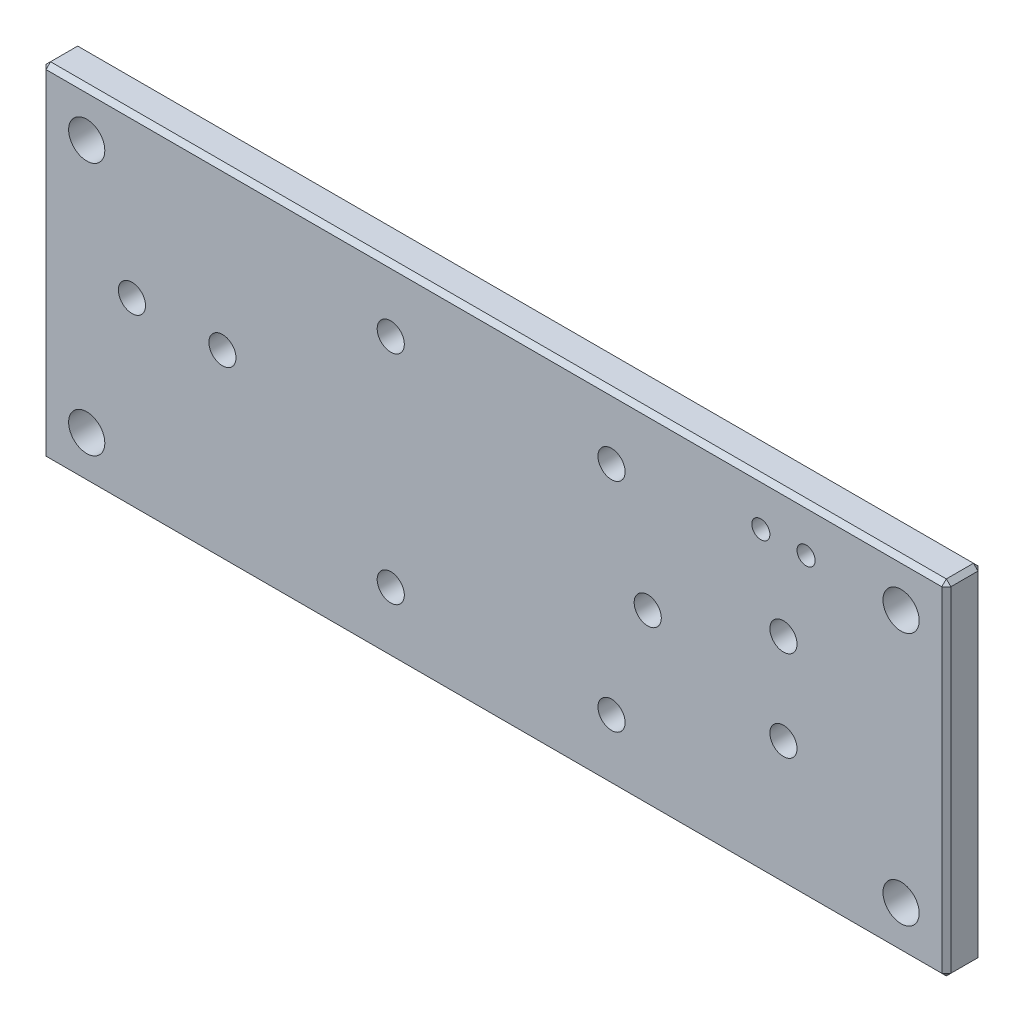
ISO-10303-21;
HEADER;
FILE_DESCRIPTION(('STEP AP214'),'2;1');
FILE_NAME('part.step','',(''),(''),'','','');
FILE_SCHEMA(('AUTOMOTIVE_DESIGN { 1 0 10303 214 1 1 1 1 }'));
ENDSEC;
DATA;
#1=APPLICATION_CONTEXT('core data for automotive mechanical design processes');
#2=APPLICATION_PROTOCOL_DEFINITION('international standard','automotive_design',2000,#1);
#3=PRODUCT_CONTEXT('',#1,'mechanical');
#4=PRODUCT('Part','Part','',(#3));
#5=PRODUCT_RELATED_PRODUCT_CATEGORY('part','',(#4));
#6=PRODUCT_DEFINITION_FORMATION('','',#4);
#7=PRODUCT_DEFINITION_CONTEXT('part definition',#1,'design');
#8=PRODUCT_DEFINITION('design','',#6,#7);
#9=PRODUCT_DEFINITION_SHAPE('','',#8);
#10=(LENGTH_UNIT() NAMED_UNIT(*) SI_UNIT(.MILLI.,.METRE.));
#11=(NAMED_UNIT(*) PLANE_ANGLE_UNIT() SI_UNIT($,.RADIAN.));
#12=(NAMED_UNIT(*) SI_UNIT($,.STERADIAN.) SOLID_ANGLE_UNIT());
#13=UNCERTAINTY_MEASURE_WITH_UNIT(LENGTH_MEASURE(1.E-05),#10,'distance_accuracy_value','');
#14=(GEOMETRIC_REPRESENTATION_CONTEXT(3) GLOBAL_UNCERTAINTY_ASSIGNED_CONTEXT((#13)) GLOBAL_UNIT_ASSIGNED_CONTEXT((#10,
#11,#12)) REPRESENTATION_CONTEXT('',''));
#15=CARTESIAN_POINT('',(0.,0.,0.));
#16=DIRECTION('',(0.,0.,1.));
#17=DIRECTION('',(1.,0.,0.));
#18=AXIS2_PLACEMENT_3D('',#15,#16,#17);
#19=CARTESIAN_POINT('',(0.,0.,2.));
#20=DIRECTION('',(0.,0.,-1.));
#21=DIRECTION('',(-1.,0.,0.));
#22=AXIS2_PLACEMENT_3D('',#19,#20,#21);
#23=PLANE('',#22);
#24=DIRECTION('',(-1.,0.,0.));
#25=VECTOR('',#24,1.);
#26=CARTESIAN_POINT('',(0.,9.25,2.));
#27=LINE('',#26,#25);
#28=CARTESIAN_POINT('',(24.75,9.25,2.));
#29=VERTEX_POINT('',#28);
#30=CARTESIAN_POINT('',(-24.75,9.25,2.));
#31=VERTEX_POINT('',#30);
#32=EDGE_CURVE('E188',#29,#31,#27,.T.);
#33=ORIENTED_EDGE('',*,*,#32,.T.);
#34=DIRECTION('',(0.,-1.,0.));
#35=VECTOR('',#34,1.);
#36=CARTESIAN_POINT('',(-24.75,0.,2.));
#37=LINE('',#36,#35);
#38=CARTESIAN_POINT('',(-24.75,-9.25,2.));
#39=VERTEX_POINT('',#38);
#40=EDGE_CURVE('E190',#31,#39,#37,.T.);
#41=ORIENTED_EDGE('',*,*,#40,.T.);
#42=DIRECTION('',(1.,0.,0.));
#43=VECTOR('',#42,1.);
#44=CARTESIAN_POINT('',(0.,-9.25,2.));
#45=LINE('',#44,#43);
#46=CARTESIAN_POINT('',(24.75,-9.25,2.));
#47=VERTEX_POINT('',#46);
#48=EDGE_CURVE('E184',#39,#47,#45,.T.);
#49=ORIENTED_EDGE('',*,*,#48,.T.);
#50=DIRECTION('',(0.,1.,0.));
#51=VECTOR('',#50,1.);
#52=CARTESIAN_POINT('',(24.75,0.,2.));
#53=LINE('',#52,#51);
#54=EDGE_CURVE('E186',#47,#29,#53,.T.);
#55=ORIENTED_EDGE('',*,*,#54,.T.);
#56=EDGE_LOOP('',(#33,#41,#49,#55));
#57=FACE_BOUND('',#56,.T.);
#58=CARTESIAN_POINT('',(17.25,7.,2.));
#59=DIRECTION('',(0.,0.,1.));
#60=DIRECTION('',(1.,0.,0.));
#61=AXIS2_PLACEMENT_3D('',#58,#59,#60);
#62=CIRCLE('',#61,0.499999999999999);
#63=CARTESIAN_POINT('',(17.75,7.,2.));
#64=VERTEX_POINT('',#63);
#65=EDGE_CURVE('E260',#64,#64,#62,.T.);
#66=ORIENTED_EDGE('',*,*,#65,.F.);
#67=EDGE_LOOP('',(#66));
#68=FACE_BOUND('',#67,.T.);
#69=CARTESIAN_POINT('',(14.75,7.,2.));
#70=DIRECTION('',(0.,0.,1.));
#71=DIRECTION('',(1.,0.,0.));
#72=AXIS2_PLACEMENT_3D('',#69,#70,#71);
#73=CIRCLE('',#72,0.500000000000001);
#74=CARTESIAN_POINT('',(15.25,7.,2.));
#75=VERTEX_POINT('',#74);
#76=EDGE_CURVE('E271',#75,#75,#73,.T.);
#77=ORIENTED_EDGE('',*,*,#76,.F.);
#78=EDGE_LOOP('',(#77));
#79=FACE_BOUND('',#78,.T.);
#80=CARTESIAN_POINT('',(-15.,0.699999999999999,2.));
#81=DIRECTION('',(0.,0.,1.));
#82=DIRECTION('',(1.,0.,0.));
#83=AXIS2_PLACEMENT_3D('',#80,#81,#82);
#84=CIRCLE('',#83,0.750000000000002);
#85=CARTESIAN_POINT('',(-14.25,0.699999999999999,2.));
#86=VERTEX_POINT('',#85);
#87=EDGE_CURVE('E277',#86,#86,#84,.T.);
#88=ORIENTED_EDGE('',*,*,#87,.F.);
#89=EDGE_LOOP('',(#88));
#90=FACE_BOUND('',#89,.T.);
#91=CARTESIAN_POINT('',(-20.,0.699999999999999,2.));
#92=DIRECTION('',(0.,0.,1.));
#93=DIRECTION('',(1.,0.,0.));
#94=AXIS2_PLACEMENT_3D('',#91,#92,#93);
#95=CIRCLE('',#94,0.750000000000002);
#96=CARTESIAN_POINT('',(-19.25,0.699999999999999,2.));
#97=VERTEX_POINT('',#96);
#98=EDGE_CURVE('E283',#97,#97,#95,.T.);
#99=ORIENTED_EDGE('',*,*,#98,.F.);
#100=EDGE_LOOP('',(#99));
#101=FACE_BOUND('',#100,.T.);
#102=CARTESIAN_POINT('',(16.,-2.5,2.));
#103=DIRECTION('',(0.,0.,1.));
#104=DIRECTION('',(1.,0.,0.));
#105=AXIS2_PLACEMENT_3D('',#102,#103,#104);
#106=CIRCLE('',#105,0.750000000000002);
#107=CARTESIAN_POINT('',(16.75,-2.5,2.));
#108=VERTEX_POINT('',#107);
#109=EDGE_CURVE('E289',#108,#108,#106,.T.);
#110=ORIENTED_EDGE('',*,*,#109,.F.);
#111=EDGE_LOOP('',(#110));
#112=FACE_BOUND('',#111,.T.);
#113=CARTESIAN_POINT('',(16.,2.5,2.));
#114=DIRECTION('',(0.,0.,1.));
#115=DIRECTION('',(1.,0.,0.));
#116=AXIS2_PLACEMENT_3D('',#113,#114,#115);
#117=CIRCLE('',#116,0.750000000000002);
#118=CARTESIAN_POINT('',(16.75,2.5,2.));
#119=VERTEX_POINT('',#118);
#120=EDGE_CURVE('E295',#119,#119,#117,.T.);
#121=ORIENTED_EDGE('',*,*,#120,.F.);
#122=EDGE_LOOP('',(#121));
#123=FACE_BOUND('',#122,.T.);
#124=CARTESIAN_POINT('',(8.49999999999999,0.,2.));
#125=DIRECTION('',(0.,0.,1.));
#126=DIRECTION('',(1.,0.,0.));
#127=AXIS2_PLACEMENT_3D('',#124,#125,#126);
#128=CIRCLE('',#127,0.750000000000002);
#129=CARTESIAN_POINT('',(9.25,0.,2.));
#130=VERTEX_POINT('',#129);
#131=EDGE_CURVE('E301',#130,#130,#128,.T.);
#132=ORIENTED_EDGE('',*,*,#131,.F.);
#133=EDGE_LOOP('',(#132));
#134=FACE_BOUND('',#133,.T.);
#135=CARTESIAN_POINT('',(6.5,-6.,2.));
#136=DIRECTION('',(0.,0.,1.));
#137=DIRECTION('',(1.,0.,0.));
#138=AXIS2_PLACEMENT_3D('',#135,#136,#137);
#139=CIRCLE('',#138,0.750000000000002);
#140=CARTESIAN_POINT('',(7.25,-6.,2.));
#141=VERTEX_POINT('',#140);
#142=EDGE_CURVE('E307',#141,#141,#139,.T.);
#143=ORIENTED_EDGE('',*,*,#142,.F.);
#144=EDGE_LOOP('',(#143));
#145=FACE_BOUND('',#144,.T.);
#146=CARTESIAN_POINT('',(6.5,6.,2.));
#147=DIRECTION('',(0.,0.,1.));
#148=DIRECTION('',(1.,0.,0.));
#149=AXIS2_PLACEMENT_3D('',#146,#147,#148);
#150=CIRCLE('',#149,0.750000000000002);
#151=CARTESIAN_POINT('',(7.25,6.,2.));
#152=VERTEX_POINT('',#151);
#153=EDGE_CURVE('E313',#152,#152,#150,.T.);
#154=ORIENTED_EDGE('',*,*,#153,.F.);
#155=EDGE_LOOP('',(#154));
#156=FACE_BOUND('',#155,.T.);
#157=CARTESIAN_POINT('',(-5.7,-6.,2.));
#158=DIRECTION('',(0.,0.,1.));
#159=DIRECTION('',(1.,0.,0.));
#160=AXIS2_PLACEMENT_3D('',#157,#158,#159);
#161=CIRCLE('',#160,0.75);
#162=CARTESIAN_POINT('',(-4.95,-6.,2.));
#163=VERTEX_POINT('',#162);
#164=EDGE_CURVE('E319',#163,#163,#161,.T.);
#165=ORIENTED_EDGE('',*,*,#164,.F.);
#166=EDGE_LOOP('',(#165));
#167=FACE_BOUND('',#166,.T.);
#168=CARTESIAN_POINT('',(-5.7,6.,2.));
#169=DIRECTION('',(0.,0.,1.));
#170=DIRECTION('',(1.,0.,0.));
#171=AXIS2_PLACEMENT_3D('',#168,#169,#170);
#172=CIRCLE('',#171,0.75);
#173=CARTESIAN_POINT('',(-4.95,6.,2.));
#174=VERTEX_POINT('',#173);
#175=EDGE_CURVE('E325',#174,#174,#172,.T.);
#176=ORIENTED_EDGE('',*,*,#175,.F.);
#177=EDGE_LOOP('',(#176));
#178=FACE_BOUND('',#177,.T.);
#179=CARTESIAN_POINT('',(-22.5,7.,2.));
#180=DIRECTION('',(0.,0.,1.));
#181=DIRECTION('',(1.,0.,0.));
#182=AXIS2_PLACEMENT_3D('',#179,#180,#181);
#183=CIRCLE('',#182,1.);
#184=CARTESIAN_POINT('',(-21.5,7.,2.));
#185=VERTEX_POINT('',#184);
#186=EDGE_CURVE('E156',#185,#185,#183,.T.);
#187=ORIENTED_EDGE('',*,*,#186,.F.);
#188=EDGE_LOOP('',(#187));
#189=FACE_BOUND('',#188,.T.);
#190=CARTESIAN_POINT('',(22.5,7.,2.));
#191=DIRECTION('',(0.,0.,1.));
#192=DIRECTION('',(1.,0.,0.));
#193=AXIS2_PLACEMENT_3D('',#190,#191,#192);
#194=CIRCLE('',#193,1.);
#195=CARTESIAN_POINT('',(23.5,7.,2.));
#196=VERTEX_POINT('',#195);
#197=EDGE_CURVE('E346',#196,#196,#194,.T.);
#198=ORIENTED_EDGE('',*,*,#197,.F.);
#199=EDGE_LOOP('',(#198));
#200=FACE_BOUND('',#199,.T.);
#201=CARTESIAN_POINT('',(22.5,-7.,2.));
#202=DIRECTION('',(0.,0.,1.));
#203=DIRECTION('',(1.,0.,0.));
#204=AXIS2_PLACEMENT_3D('',#201,#202,#203);
#205=CIRCLE('',#204,1.);
#206=CARTESIAN_POINT('',(23.5,-7.,2.));
#207=VERTEX_POINT('',#206);
#208=EDGE_CURVE('E340',#207,#207,#205,.T.);
#209=ORIENTED_EDGE('',*,*,#208,.F.);
#210=EDGE_LOOP('',(#209));
#211=FACE_BOUND('',#210,.T.);
#212=CARTESIAN_POINT('',(-22.5,-7.,2.));
#213=DIRECTION('',(0.,0.,1.));
#214=DIRECTION('',(1.,0.,0.));
#215=AXIS2_PLACEMENT_3D('',#212,#213,#214);
#216=CIRCLE('',#215,1.);
#217=CARTESIAN_POINT('',(-21.5,-7.,2.));
#218=VERTEX_POINT('',#217);
#219=EDGE_CURVE('E334',#218,#218,#216,.T.);
#220=ORIENTED_EDGE('',*,*,#219,.F.);
#221=EDGE_LOOP('',(#220));
#222=FACE_BOUND('',#221,.T.);
#223=ADVANCED_FACE('F35',(#57,#68,#79,#90,#101,#112,#123,#134,#145,#156,#167,#178,#189,#200,
#211,#222),#23,.F.);
#224=CARTESIAN_POINT('',(0.,0.,0.));
#225=DIRECTION('',(0.,0.,-1.));
#226=DIRECTION('',(-1.,0.,0.));
#227=AXIS2_PLACEMENT_3D('',#224,#225,#226);
#228=PLANE('',#227);
#229=DIRECTION('',(-1.,0.,0.));
#230=VECTOR('',#229,1.);
#231=CARTESIAN_POINT('',(-25.,-9.25,0.));
#232=LINE('',#231,#230);
#233=CARTESIAN_POINT('',(24.75,-9.25,0.));
#234=VERTEX_POINT('',#233);
#235=CARTESIAN_POINT('',(-24.75,-9.25,0.));
#236=VERTEX_POINT('',#235);
#237=EDGE_CURVE('E175',#234,#236,#232,.T.);
#238=ORIENTED_EDGE('',*,*,#237,.T.);
#239=DIRECTION('',(0.,1.,0.));
#240=VECTOR('',#239,1.);
#241=CARTESIAN_POINT('',(-24.75,9.5,0.));
#242=LINE('',#241,#240);
#243=CARTESIAN_POINT('',(-24.75,9.25,0.));
#244=VERTEX_POINT('',#243);
#245=EDGE_CURVE('E181',#236,#244,#242,.T.);
#246=ORIENTED_EDGE('',*,*,#245,.T.);
#247=DIRECTION('',(1.,0.,0.));
#248=VECTOR('',#247,1.);
#249=CARTESIAN_POINT('',(25.,9.25,0.));
#250=LINE('',#249,#248);
#251=CARTESIAN_POINT('',(24.75,9.25,0.));
#252=VERTEX_POINT('',#251);
#253=EDGE_CURVE('E179',#244,#252,#250,.T.);
#254=ORIENTED_EDGE('',*,*,#253,.T.);
#255=DIRECTION('',(0.,-1.,0.));
#256=VECTOR('',#255,1.);
#257=CARTESIAN_POINT('',(24.75,-9.5,0.));
#258=LINE('',#257,#256);
#259=EDGE_CURVE('E177',#252,#234,#258,.T.);
#260=ORIENTED_EDGE('',*,*,#259,.T.);
#261=EDGE_LOOP('',(#238,#246,#254,#260));
#262=FACE_BOUND('',#261,.T.);
#263=CARTESIAN_POINT('',(17.25,7.,0.));
#264=DIRECTION('',(0.,0.,1.));
#265=DIRECTION('',(1.,0.,0.));
#266=AXIS2_PLACEMENT_3D('',#263,#264,#265);
#267=CIRCLE('',#266,0.499999999999999);
#268=CARTESIAN_POINT('',(17.75,7.,0.));
#269=VERTEX_POINT('',#268);
#270=EDGE_CURVE('E266',#269,#269,#267,.T.);
#271=ORIENTED_EDGE('',*,*,#270,.T.);
#272=EDGE_LOOP('',(#271));
#273=FACE_BOUND('',#272,.T.);
#274=CARTESIAN_POINT('',(14.75,7.,0.));
#275=DIRECTION('',(0.,0.,1.));
#276=DIRECTION('',(1.,0.,0.));
#277=AXIS2_PLACEMENT_3D('',#274,#275,#276);
#278=CIRCLE('',#277,0.500000000000001);
#279=CARTESIAN_POINT('',(15.25,7.,0.));
#280=VERTEX_POINT('',#279);
#281=EDGE_CURVE('E274',#280,#280,#278,.T.);
#282=ORIENTED_EDGE('',*,*,#281,.T.);
#283=EDGE_LOOP('',(#282));
#284=FACE_BOUND('',#283,.T.);
#285=CARTESIAN_POINT('',(-15.,0.699999999999999,0.));
#286=DIRECTION('',(0.,0.,1.));
#287=DIRECTION('',(1.,0.,0.));
#288=AXIS2_PLACEMENT_3D('',#285,#286,#287);
#289=CIRCLE('',#288,0.750000000000002);
#290=CARTESIAN_POINT('',(-14.25,0.699999999999999,0.));
#291=VERTEX_POINT('',#290);
#292=EDGE_CURVE('E280',#291,#291,#289,.T.);
#293=ORIENTED_EDGE('',*,*,#292,.T.);
#294=EDGE_LOOP('',(#293));
#295=FACE_BOUND('',#294,.T.);
#296=CARTESIAN_POINT('',(-20.,0.699999999999999,0.));
#297=DIRECTION('',(0.,0.,1.));
#298=DIRECTION('',(1.,0.,0.));
#299=AXIS2_PLACEMENT_3D('',#296,#297,#298);
#300=CIRCLE('',#299,0.750000000000002);
#301=CARTESIAN_POINT('',(-19.25,0.699999999999999,0.));
#302=VERTEX_POINT('',#301);
#303=EDGE_CURVE('E286',#302,#302,#300,.T.);
#304=ORIENTED_EDGE('',*,*,#303,.T.);
#305=EDGE_LOOP('',(#304));
#306=FACE_BOUND('',#305,.T.);
#307=CARTESIAN_POINT('',(16.,-2.5,0.));
#308=DIRECTION('',(0.,0.,1.));
#309=DIRECTION('',(1.,0.,0.));
#310=AXIS2_PLACEMENT_3D('',#307,#308,#309);
#311=CIRCLE('',#310,0.750000000000002);
#312=CARTESIAN_POINT('',(16.75,-2.5,0.));
#313=VERTEX_POINT('',#312);
#314=EDGE_CURVE('E292',#313,#313,#311,.T.);
#315=ORIENTED_EDGE('',*,*,#314,.T.);
#316=EDGE_LOOP('',(#315));
#317=FACE_BOUND('',#316,.T.);
#318=CARTESIAN_POINT('',(16.,2.5,0.));
#319=DIRECTION('',(0.,0.,1.));
#320=DIRECTION('',(1.,0.,0.));
#321=AXIS2_PLACEMENT_3D('',#318,#319,#320);
#322=CIRCLE('',#321,0.750000000000002);
#323=CARTESIAN_POINT('',(16.75,2.5,0.));
#324=VERTEX_POINT('',#323);
#325=EDGE_CURVE('E298',#324,#324,#322,.T.);
#326=ORIENTED_EDGE('',*,*,#325,.T.);
#327=EDGE_LOOP('',(#326));
#328=FACE_BOUND('',#327,.T.);
#329=CARTESIAN_POINT('',(8.49999999999999,0.,0.));
#330=DIRECTION('',(0.,0.,1.));
#331=DIRECTION('',(1.,0.,0.));
#332=AXIS2_PLACEMENT_3D('',#329,#330,#331);
#333=CIRCLE('',#332,0.750000000000002);
#334=CARTESIAN_POINT('',(9.25,0.,0.));
#335=VERTEX_POINT('',#334);
#336=EDGE_CURVE('E304',#335,#335,#333,.T.);
#337=ORIENTED_EDGE('',*,*,#336,.T.);
#338=EDGE_LOOP('',(#337));
#339=FACE_BOUND('',#338,.T.);
#340=CARTESIAN_POINT('',(6.5,-6.,0.));
#341=DIRECTION('',(0.,0.,1.));
#342=DIRECTION('',(1.,0.,0.));
#343=AXIS2_PLACEMENT_3D('',#340,#341,#342);
#344=CIRCLE('',#343,0.750000000000002);
#345=CARTESIAN_POINT('',(7.25,-6.,0.));
#346=VERTEX_POINT('',#345);
#347=EDGE_CURVE('E310',#346,#346,#344,.T.);
#348=ORIENTED_EDGE('',*,*,#347,.T.);
#349=EDGE_LOOP('',(#348));
#350=FACE_BOUND('',#349,.T.);
#351=CARTESIAN_POINT('',(6.5,6.,0.));
#352=DIRECTION('',(0.,0.,1.));
#353=DIRECTION('',(1.,0.,0.));
#354=AXIS2_PLACEMENT_3D('',#351,#352,#353);
#355=CIRCLE('',#354,0.750000000000002);
#356=CARTESIAN_POINT('',(7.25,6.,0.));
#357=VERTEX_POINT('',#356);
#358=EDGE_CURVE('E316',#357,#357,#355,.T.);
#359=ORIENTED_EDGE('',*,*,#358,.T.);
#360=EDGE_LOOP('',(#359));
#361=FACE_BOUND('',#360,.T.);
#362=CARTESIAN_POINT('',(-5.7,-6.,0.));
#363=DIRECTION('',(0.,0.,1.));
#364=DIRECTION('',(1.,0.,0.));
#365=AXIS2_PLACEMENT_3D('',#362,#363,#364);
#366=CIRCLE('',#365,0.75);
#367=CARTESIAN_POINT('',(-4.95,-6.,0.));
#368=VERTEX_POINT('',#367);
#369=EDGE_CURVE('E322',#368,#368,#366,.T.);
#370=ORIENTED_EDGE('',*,*,#369,.T.);
#371=EDGE_LOOP('',(#370));
#372=FACE_BOUND('',#371,.T.);
#373=CARTESIAN_POINT('',(-5.7,6.,0.));
#374=DIRECTION('',(0.,0.,1.));
#375=DIRECTION('',(1.,0.,0.));
#376=AXIS2_PLACEMENT_3D('',#373,#374,#375);
#377=CIRCLE('',#376,0.75);
#378=CARTESIAN_POINT('',(-4.95,6.,0.));
#379=VERTEX_POINT('',#378);
#380=EDGE_CURVE('E328',#379,#379,#377,.T.);
#381=ORIENTED_EDGE('',*,*,#380,.T.);
#382=EDGE_LOOP('',(#381));
#383=FACE_BOUND('',#382,.T.);
#384=CARTESIAN_POINT('',(22.5,-7.,0.));
#385=DIRECTION('',(0.,0.,1.));
#386=DIRECTION('',(1.,0.,0.));
#387=AXIS2_PLACEMENT_3D('',#384,#385,#386);
#388=CIRCLE('',#387,1.);
#389=CARTESIAN_POINT('',(23.5,-7.,0.));
#390=VERTEX_POINT('',#389);
#391=EDGE_CURVE('E337',#390,#390,#388,.T.);
#392=ORIENTED_EDGE('',*,*,#391,.T.);
#393=EDGE_LOOP('',(#392));
#394=FACE_BOUND('',#393,.T.);
#395=CARTESIAN_POINT('',(-22.5,7.,0.));
#396=DIRECTION('',(0.,0.,1.));
#397=DIRECTION('',(1.,0.,0.));
#398=AXIS2_PLACEMENT_3D('',#395,#396,#397);
#399=CIRCLE('',#398,1.);
#400=CARTESIAN_POINT('',(-21.5,7.,0.));
#401=VERTEX_POINT('',#400);
#402=EDGE_CURVE('E159',#401,#401,#399,.T.);
#403=ORIENTED_EDGE('',*,*,#402,.T.);
#404=EDGE_LOOP('',(#403));
#405=FACE_BOUND('',#404,.T.);
#406=CARTESIAN_POINT('',(22.5,7.,0.));
#407=DIRECTION('',(0.,0.,1.));
#408=DIRECTION('',(1.,0.,0.));
#409=AXIS2_PLACEMENT_3D('',#406,#407,#408);
#410=CIRCLE('',#409,1.);
#411=CARTESIAN_POINT('',(23.5,7.,0.));
#412=VERTEX_POINT('',#411);
#413=EDGE_CURVE('E343',#412,#412,#410,.T.);
#414=ORIENTED_EDGE('',*,*,#413,.T.);
#415=EDGE_LOOP('',(#414));
#416=FACE_BOUND('',#415,.T.);
#417=CARTESIAN_POINT('',(-22.5,-7.,0.));
#418=DIRECTION('',(0.,0.,1.));
#419=DIRECTION('',(1.,0.,0.));
#420=AXIS2_PLACEMENT_3D('',#417,#418,#419);
#421=CIRCLE('',#420,1.);
#422=CARTESIAN_POINT('',(-21.5,-7.,0.));
#423=VERTEX_POINT('',#422);
#424=EDGE_CURVE('E331',#423,#423,#421,.T.);
#425=ORIENTED_EDGE('',*,*,#424,.T.);
#426=EDGE_LOOP('',(#425));
#427=FACE_BOUND('',#426,.T.);
#428=ADVANCED_FACE('F352',(#262,#273,#284,#295,#306,#317,#328,#339,#350,#361,#372,#383,#394,
#405,#416,#427),#228,.T.);
#429=CARTESIAN_POINT('',(25.,-9.5,2.));
#430=DIRECTION('',(-1.,0.,0.));
#431=DIRECTION('',(0.,0.,1.));
#432=AXIS2_PLACEMENT_3D('',#429,#430,#431);
#433=PLANE('',#432);
#434=DIRECTION('',(0.,1.,0.));
#435=VECTOR('',#434,1.);
#436=CARTESIAN_POINT('',(25.,9.5,0.25));
#437=LINE('',#436,#435);
#438=CARTESIAN_POINT('',(25.,-9.25,0.25));
#439=VERTEX_POINT('',#438);
#440=CARTESIAN_POINT('',(25.,9.25,0.25));
#441=VERTEX_POINT('',#440);
#442=EDGE_CURVE('E44',#439,#441,#437,.T.);
#443=ORIENTED_EDGE('',*,*,#442,.T.);
#444=DIRECTION('',(0.,0.,1.));
#445=VECTOR('',#444,1.);
#446=CARTESIAN_POINT('',(25.,9.25,2.));
#447=LINE('',#446,#445);
#448=CARTESIAN_POINT('',(25.,9.25,1.75));
#449=VERTEX_POINT('',#448);
#450=EDGE_CURVE('E11',#441,#449,#447,.T.);
#451=ORIENTED_EDGE('',*,*,#450,.T.);
#452=DIRECTION('',(0.,-1.,0.));
#453=VECTOR('',#452,1.);
#454=CARTESIAN_POINT('',(25.,-9.5,1.75));
#455=LINE('',#454,#453);
#456=CARTESIAN_POINT('',(25.,-9.25,1.75));
#457=VERTEX_POINT('',#456);
#458=EDGE_CURVE('E202',#449,#457,#455,.T.);
#459=ORIENTED_EDGE('',*,*,#458,.T.);
#460=DIRECTION('',(0.,0.,-1.));
#461=VECTOR('',#460,1.);
#462=CARTESIAN_POINT('',(25.,-9.25,2.));
#463=LINE('',#462,#461);
#464=EDGE_CURVE('E55',#457,#439,#463,.T.);
#465=ORIENTED_EDGE('',*,*,#464,.T.);
#466=EDGE_LOOP('',(#443,#451,#459,#465));
#467=FACE_BOUND('',#466,.T.);
#468=ADVANCED_FACE('F376',(#467),#433,.F.);
#469=CARTESIAN_POINT('',(-25.,9.5,2.));
#470=DIRECTION('',(0.,-1.,0.));
#471=DIRECTION('',(0.,0.,-1.));
#472=AXIS2_PLACEMENT_3D('',#469,#470,#471);
#473=PLANE('',#472);
#474=DIRECTION('',(-1.,0.,0.));
#475=VECTOR('',#474,1.);
#476=CARTESIAN_POINT('',(-25.,9.5,0.25));
#477=LINE('',#476,#475);
#478=CARTESIAN_POINT('',(24.75,9.5,0.25));
#479=VERTEX_POINT('',#478);
#480=CARTESIAN_POINT('',(-24.75,9.5,0.25));
#481=VERTEX_POINT('',#480);
#482=EDGE_CURVE('E197',#479,#481,#477,.T.);
#483=ORIENTED_EDGE('',*,*,#482,.T.);
#484=DIRECTION('',(0.,0.,1.));
#485=VECTOR('',#484,1.);
#486=CARTESIAN_POINT('',(-24.75,9.5,2.));
#487=LINE('',#486,#485);
#488=CARTESIAN_POINT('',(-24.75,9.5,1.75));
#489=VERTEX_POINT('',#488);
#490=EDGE_CURVE('E199',#481,#489,#487,.T.);
#491=ORIENTED_EDGE('',*,*,#490,.T.);
#492=DIRECTION('',(1.,0.,0.));
#493=VECTOR('',#492,1.);
#494=CARTESIAN_POINT('',(-25.,9.5,1.75));
#495=LINE('',#494,#493);
#496=CARTESIAN_POINT('',(24.75,9.5,1.75));
#497=VERTEX_POINT('',#496);
#498=EDGE_CURVE('E195',#489,#497,#495,.T.);
#499=ORIENTED_EDGE('',*,*,#498,.T.);
#500=DIRECTION('',(0.,0.,-1.));
#501=VECTOR('',#500,1.);
#502=CARTESIAN_POINT('',(24.75,9.5,2.));
#503=LINE('',#502,#501);
#504=EDGE_CURVE('E193',#497,#479,#503,.T.);
#505=ORIENTED_EDGE('',*,*,#504,.T.);
#506=EDGE_LOOP('',(#483,#491,#499,#505));
#507=FACE_BOUND('',#506,.T.);
#508=ADVANCED_FACE('F386',(#507),#473,.F.);
#509=CARTESIAN_POINT('',(-25.,-9.5,2.));
#510=DIRECTION('',(1.,0.,0.));
#511=DIRECTION('',(0.,0.,-1.));
#512=AXIS2_PLACEMENT_3D('',#509,#510,#511);
#513=PLANE('',#512);
#514=DIRECTION('',(0.,-1.,0.));
#515=VECTOR('',#514,1.);
#516=CARTESIAN_POINT('',(-25.,-9.5,0.25));
#517=LINE('',#516,#515);
#518=CARTESIAN_POINT('',(-25.,9.25,0.25));
#519=VERTEX_POINT('',#518);
#520=CARTESIAN_POINT('',(-25.,-9.25,0.25));
#521=VERTEX_POINT('',#520);
#522=EDGE_CURVE('E170',#519,#521,#517,.T.);
#523=ORIENTED_EDGE('',*,*,#522,.T.);
#524=DIRECTION('',(0.,0.,1.));
#525=VECTOR('',#524,1.);
#526=CARTESIAN_POINT('',(-25.,-9.25,2.));
#527=LINE('',#526,#525);
#528=CARTESIAN_POINT('',(-25.,-9.25,1.75));
#529=VERTEX_POINT('',#528);
#530=EDGE_CURVE('E172',#521,#529,#527,.T.);
#531=ORIENTED_EDGE('',*,*,#530,.T.);
#532=DIRECTION('',(0.,1.,0.));
#533=VECTOR('',#532,1.);
#534=CARTESIAN_POINT('',(-25.,-9.5,1.75));
#535=LINE('',#534,#533);
#536=CARTESIAN_POINT('',(-25.,9.25,1.75));
#537=VERTEX_POINT('',#536);
#538=EDGE_CURVE('E168',#529,#537,#535,.T.);
#539=ORIENTED_EDGE('',*,*,#538,.T.);
#540=DIRECTION('',(0.,0.,-1.));
#541=VECTOR('',#540,1.);
#542=CARTESIAN_POINT('',(-25.,9.25,2.));
#543=LINE('',#542,#541);
#544=EDGE_CURVE('E166',#537,#519,#543,.T.);
#545=ORIENTED_EDGE('',*,*,#544,.T.);
#546=EDGE_LOOP('',(#523,#531,#539,#545));
#547=FACE_BOUND('',#546,.T.);
#548=ADVANCED_FACE('F383',(#547),#513,.F.);
#549=CARTESIAN_POINT('',(-25.,-9.5,2.));
#550=DIRECTION('',(0.,1.,0.));
#551=DIRECTION('',(0.,0.,1.));
#552=AXIS2_PLACEMENT_3D('',#549,#550,#551);
#553=PLANE('',#552);
#554=DIRECTION('',(-1.,0.,0.));
#555=VECTOR('',#554,1.);
#556=CARTESIAN_POINT('',(-25.,-9.5,1.75));
#557=LINE('',#556,#555);
#558=CARTESIAN_POINT('',(24.75,-9.5,1.75));
#559=VERTEX_POINT('',#558);
#560=CARTESIAN_POINT('',(-24.75,-9.5,1.75));
#561=VERTEX_POINT('',#560);
#562=EDGE_CURVE('E127',#559,#561,#557,.T.);
#563=ORIENTED_EDGE('',*,*,#562,.T.);
#564=DIRECTION('',(0.,0.,-1.));
#565=VECTOR('',#564,1.);
#566=CARTESIAN_POINT('',(-24.75,-9.5,2.));
#567=LINE('',#566,#565);
#568=CARTESIAN_POINT('',(-24.75,-9.5,0.25));
#569=VERTEX_POINT('',#568);
#570=EDGE_CURVE('E164',#561,#569,#567,.T.);
#571=ORIENTED_EDGE('',*,*,#570,.T.);
#572=DIRECTION('',(1.,0.,0.));
#573=VECTOR('',#572,1.);
#574=CARTESIAN_POINT('',(25.,-9.5,0.25));
#575=LINE('',#574,#573);
#576=CARTESIAN_POINT('',(24.75,-9.5,0.25));
#577=VERTEX_POINT('',#576);
#578=EDGE_CURVE('E130',#569,#577,#575,.T.);
#579=ORIENTED_EDGE('',*,*,#578,.T.);
#580=DIRECTION('',(0.,0.,1.));
#581=VECTOR('',#580,1.);
#582=CARTESIAN_POINT('',(24.75,-9.5,2.));
#583=LINE('',#582,#581);
#584=EDGE_CURVE('E122',#577,#559,#583,.T.);
#585=ORIENTED_EDGE('',*,*,#584,.T.);
#586=EDGE_LOOP('',(#563,#571,#579,#585));
#587=FACE_BOUND('',#586,.T.);
#588=ADVANCED_FACE('F124',(#587),#553,.F.);
#589=CARTESIAN_POINT('',(-22.5,7.,2.));
#590=DIRECTION('',(0.,0.,-1.));
#591=DIRECTION('',(-1.,0.,0.));
#592=AXIS2_PLACEMENT_3D('',#589,#590,#591);
#593=CYLINDRICAL_SURFACE('',#592,1.);
#594=ORIENTED_EDGE('',*,*,#186,.T.);
#595=EDGE_LOOP('',(#594));
#596=FACE_BOUND('',#595,.T.);
#597=ORIENTED_EDGE('',*,*,#402,.F.);
#598=EDGE_LOOP('',(#597));
#599=FACE_BOUND('',#598,.T.);
#600=ADVANCED_FACE('F358',(#596,#599),#593,.F.);
#601=CARTESIAN_POINT('',(22.5,7.,2.));
#602=DIRECTION('',(0.,0.,-1.));
#603=DIRECTION('',(-1.,0.,0.));
#604=AXIS2_PLACEMENT_3D('',#601,#602,#603);
#605=CYLINDRICAL_SURFACE('',#604,1.);
#606=ORIENTED_EDGE('',*,*,#197,.T.);
#607=EDGE_LOOP('',(#606));
#608=FACE_BOUND('',#607,.T.);
#609=ORIENTED_EDGE('',*,*,#413,.F.);
#610=EDGE_LOOP('',(#609));
#611=FACE_BOUND('',#610,.T.);
#612=ADVANCED_FACE('F355',(#608,#611),#605,.F.);
#613=CARTESIAN_POINT('',(22.5,-7.,2.));
#614=DIRECTION('',(0.,0.,-1.));
#615=DIRECTION('',(-1.,0.,0.));
#616=AXIS2_PLACEMENT_3D('',#613,#614,#615);
#617=CYLINDRICAL_SURFACE('',#616,1.);
#618=ORIENTED_EDGE('',*,*,#208,.T.);
#619=EDGE_LOOP('',(#618));
#620=FACE_BOUND('',#619,.T.);
#621=ORIENTED_EDGE('',*,*,#391,.F.);
#622=EDGE_LOOP('',(#621));
#623=FACE_BOUND('',#622,.T.);
#624=ADVANCED_FACE('F357',(#620,#623),#617,.F.);
#625=CARTESIAN_POINT('',(-22.5,-7.,2.));
#626=DIRECTION('',(0.,0.,-1.));
#627=DIRECTION('',(-1.,0.,0.));
#628=AXIS2_PLACEMENT_3D('',#625,#626,#627);
#629=CYLINDRICAL_SURFACE('',#628,1.);
#630=ORIENTED_EDGE('',*,*,#219,.T.);
#631=EDGE_LOOP('',(#630));
#632=FACE_BOUND('',#631,.T.);
#633=ORIENTED_EDGE('',*,*,#424,.F.);
#634=EDGE_LOOP('',(#633));
#635=FACE_BOUND('',#634,.T.);
#636=ADVANCED_FACE('F365',(#632,#635),#629,.F.);
#637=CARTESIAN_POINT('',(-5.7,6.,0.));
#638=DIRECTION('',(0.,0.,1.));
#639=DIRECTION('',(1.,0.,0.));
#640=AXIS2_PLACEMENT_3D('',#637,#638,#639);
#641=CYLINDRICAL_SURFACE('',#640,0.75);
#642=ORIENTED_EDGE('',*,*,#380,.F.);
#643=EDGE_LOOP('',(#642));
#644=FACE_BOUND('',#643,.T.);
#645=ORIENTED_EDGE('',*,*,#175,.T.);
#646=EDGE_LOOP('',(#645));
#647=FACE_BOUND('',#646,.T.);
#648=ADVANCED_FACE('F522',(#644,#647),#641,.F.);
#649=CARTESIAN_POINT('',(-5.7,-6.,0.));
#650=DIRECTION('',(0.,0.,1.));
#651=DIRECTION('',(1.,0.,0.));
#652=AXIS2_PLACEMENT_3D('',#649,#650,#651);
#653=CYLINDRICAL_SURFACE('',#652,0.75);
#654=ORIENTED_EDGE('',*,*,#369,.F.);
#655=EDGE_LOOP('',(#654));
#656=FACE_BOUND('',#655,.T.);
#657=ORIENTED_EDGE('',*,*,#164,.T.);
#658=EDGE_LOOP('',(#657));
#659=FACE_BOUND('',#658,.T.);
#660=ADVANCED_FACE('F525',(#656,#659),#653,.F.);
#661=CARTESIAN_POINT('',(6.5,6.,0.));
#662=DIRECTION('',(0.,0.,1.));
#663=DIRECTION('',(1.,0.,0.));
#664=AXIS2_PLACEMENT_3D('',#661,#662,#663);
#665=CYLINDRICAL_SURFACE('',#664,0.750000000000002);
#666=ORIENTED_EDGE('',*,*,#358,.F.);
#667=EDGE_LOOP('',(#666));
#668=FACE_BOUND('',#667,.T.);
#669=ORIENTED_EDGE('',*,*,#153,.T.);
#670=EDGE_LOOP('',(#669));
#671=FACE_BOUND('',#670,.T.);
#672=ADVANCED_FACE('F547',(#668,#671),#665,.F.);
#673=CARTESIAN_POINT('',(6.5,-6.,0.));
#674=DIRECTION('',(0.,0.,1.));
#675=DIRECTION('',(1.,0.,0.));
#676=AXIS2_PLACEMENT_3D('',#673,#674,#675);
#677=CYLINDRICAL_SURFACE('',#676,0.750000000000002);
#678=ORIENTED_EDGE('',*,*,#347,.F.);
#679=EDGE_LOOP('',(#678));
#680=FACE_BOUND('',#679,.T.);
#681=ORIENTED_EDGE('',*,*,#142,.T.);
#682=EDGE_LOOP('',(#681));
#683=FACE_BOUND('',#682,.T.);
#684=ADVANCED_FACE('F551',(#680,#683),#677,.F.);
#685=CARTESIAN_POINT('',(8.49999999999999,0.,0.));
#686=DIRECTION('',(0.,0.,1.));
#687=DIRECTION('',(1.,0.,0.));
#688=AXIS2_PLACEMENT_3D('',#685,#686,#687);
#689=CYLINDRICAL_SURFACE('',#688,0.750000000000002);
#690=ORIENTED_EDGE('',*,*,#336,.F.);
#691=EDGE_LOOP('',(#690));
#692=FACE_BOUND('',#691,.T.);
#693=ORIENTED_EDGE('',*,*,#131,.T.);
#694=EDGE_LOOP('',(#693));
#695=FACE_BOUND('',#694,.T.);
#696=ADVANCED_FACE('F555',(#692,#695),#689,.F.);
#697=CARTESIAN_POINT('',(16.,2.5,0.));
#698=DIRECTION('',(0.,0.,1.));
#699=DIRECTION('',(1.,0.,0.));
#700=AXIS2_PLACEMENT_3D('',#697,#698,#699);
#701=CYLINDRICAL_SURFACE('',#700,0.750000000000002);
#702=ORIENTED_EDGE('',*,*,#325,.F.);
#703=EDGE_LOOP('',(#702));
#704=FACE_BOUND('',#703,.T.);
#705=ORIENTED_EDGE('',*,*,#120,.T.);
#706=EDGE_LOOP('',(#705));
#707=FACE_BOUND('',#706,.T.);
#708=ADVANCED_FACE('F559',(#704,#707),#701,.F.);
#709=CARTESIAN_POINT('',(16.,-2.5,0.));
#710=DIRECTION('',(0.,0.,1.));
#711=DIRECTION('',(1.,0.,0.));
#712=AXIS2_PLACEMENT_3D('',#709,#710,#711);
#713=CYLINDRICAL_SURFACE('',#712,0.750000000000002);
#714=ORIENTED_EDGE('',*,*,#314,.F.);
#715=EDGE_LOOP('',(#714));
#716=FACE_BOUND('',#715,.T.);
#717=ORIENTED_EDGE('',*,*,#109,.T.);
#718=EDGE_LOOP('',(#717));
#719=FACE_BOUND('',#718,.T.);
#720=ADVANCED_FACE('F563',(#716,#719),#713,.F.);
#721=CARTESIAN_POINT('',(-20.,0.699999999999999,0.));
#722=DIRECTION('',(0.,0.,1.));
#723=DIRECTION('',(1.,0.,0.));
#724=AXIS2_PLACEMENT_3D('',#721,#722,#723);
#725=CYLINDRICAL_SURFACE('',#724,0.750000000000002);
#726=ORIENTED_EDGE('',*,*,#303,.F.);
#727=EDGE_LOOP('',(#726));
#728=FACE_BOUND('',#727,.T.);
#729=ORIENTED_EDGE('',*,*,#98,.T.);
#730=EDGE_LOOP('',(#729));
#731=FACE_BOUND('',#730,.T.);
#732=ADVANCED_FACE('F567',(#728,#731),#725,.F.);
#733=CARTESIAN_POINT('',(-15.,0.699999999999999,0.));
#734=DIRECTION('',(0.,0.,1.));
#735=DIRECTION('',(1.,0.,0.));
#736=AXIS2_PLACEMENT_3D('',#733,#734,#735);
#737=CYLINDRICAL_SURFACE('',#736,0.750000000000002);
#738=ORIENTED_EDGE('',*,*,#292,.F.);
#739=EDGE_LOOP('',(#738));
#740=FACE_BOUND('',#739,.T.);
#741=ORIENTED_EDGE('',*,*,#87,.T.);
#742=EDGE_LOOP('',(#741));
#743=FACE_BOUND('',#742,.T.);
#744=ADVANCED_FACE('F571',(#740,#743),#737,.F.);
#745=CARTESIAN_POINT('',(14.75,7.,0.));
#746=DIRECTION('',(0.,0.,1.));
#747=DIRECTION('',(1.,0.,0.));
#748=AXIS2_PLACEMENT_3D('',#745,#746,#747);
#749=CYLINDRICAL_SURFACE('',#748,0.500000000000001);
#750=ORIENTED_EDGE('',*,*,#281,.F.);
#751=EDGE_LOOP('',(#750));
#752=FACE_BOUND('',#751,.T.);
#753=ORIENTED_EDGE('',*,*,#76,.T.);
#754=EDGE_LOOP('',(#753));
#755=FACE_BOUND('',#754,.T.);
#756=ADVANCED_FACE('F575',(#752,#755),#749,.F.);
#757=CARTESIAN_POINT('',(17.25,7.,0.));
#758=DIRECTION('',(0.,0.,1.));
#759=DIRECTION('',(1.,0.,0.));
#760=AXIS2_PLACEMENT_3D('',#757,#758,#759);
#761=CYLINDRICAL_SURFACE('',#760,0.499999999999999);
#762=ORIENTED_EDGE('',*,*,#270,.F.);
#763=EDGE_LOOP('',(#762));
#764=FACE_BOUND('',#763,.T.);
#765=ORIENTED_EDGE('',*,*,#65,.T.);
#766=EDGE_LOOP('',(#765));
#767=FACE_BOUND('',#766,.T.);
#768=ADVANCED_FACE('F462',(#764,#767),#761,.F.);
#769=CARTESIAN_POINT('',(24.75,9.5,2.));
#770=DIRECTION('',(-0.707106781186547,-0.707106781186547,0.));
#771=DIRECTION('',(0.,0.,-1.));
#772=AXIS2_PLACEMENT_3D('',#769,#770,#771);
#773=PLANE('',#772);
#774=DIRECTION('',(0.707106781186547,-0.707106781186547,0.));
#775=VECTOR('',#774,1.);
#776=CARTESIAN_POINT('',(24.75,9.5,1.75));
#777=LINE('',#776,#775);
#778=EDGE_CURVE('E39',#449,#497,#777,.F.);
#779=ORIENTED_EDGE('',*,*,#778,.F.);
#780=ORIENTED_EDGE('',*,*,#450,.F.);
#781=DIRECTION('',(-0.707106781186547,0.707106781186547,0.));
#782=VECTOR('',#781,1.);
#783=CARTESIAN_POINT('',(24.875,9.375,0.25));
#784=LINE('',#783,#782);
#785=EDGE_CURVE('E253',#479,#441,#784,.F.);
#786=ORIENTED_EDGE('',*,*,#785,.F.);
#787=ORIENTED_EDGE('',*,*,#504,.F.);
#788=EDGE_LOOP('',(#779,#780,#786,#787));
#789=FACE_BOUND('',#788,.T.);
#790=ADVANCED_FACE('F37',(#789),#773,.F.);
#791=CARTESIAN_POINT('',(24.75,9.5,1.75));
#792=DIRECTION('',(0.577350269189626,0.577350269189626,0.577350269189626));
#793=DIRECTION('',(0.707106781186547,0.,-0.707106781186547));
#794=AXIS2_PLACEMENT_3D('',#791,#792,#793);
#795=PLANE('',#794);
#796=DIRECTION('',(-0.707106781186547,0.,0.707106781186547));
#797=VECTOR('',#796,1.);
#798=CARTESIAN_POINT('',(24.875,9.25,1.875));
#799=LINE('',#798,#797);
#800=EDGE_CURVE('E248',#449,#29,#799,.T.);
#801=ORIENTED_EDGE('',*,*,#800,.F.);
#802=ORIENTED_EDGE('',*,*,#778,.T.);
#803=DIRECTION('',(0.,0.707106781186547,-0.707106781186547));
#804=VECTOR('',#803,1.);
#805=CARTESIAN_POINT('',(24.75,9.5,1.75));
#806=LINE('',#805,#804);
#807=EDGE_CURVE('E251',#29,#497,#806,.T.);
#808=ORIENTED_EDGE('',*,*,#807,.F.);
#809=EDGE_LOOP('',(#801,#802,#808));
#810=FACE_BOUND('',#809,.T.);
#811=ADVANCED_FACE('F457',(#810),#795,.T.);
#812=CARTESIAN_POINT('',(24.75,9.25,0.));
#813=DIRECTION('',(0.577350269189626,0.577350269189626,-0.577350269189626));
#814=DIRECTION('',(-0.707106781186547,0.,-0.707106781186547));
#815=AXIS2_PLACEMENT_3D('',#812,#813,#814);
#816=PLANE('',#815);
#817=DIRECTION('',(0.,0.707106781186547,0.707106781186547));
#818=VECTOR('',#817,1.);
#819=CARTESIAN_POINT('',(24.75,9.25,0.));
#820=LINE('',#819,#818);
#821=EDGE_CURVE('E242',#479,#252,#820,.F.);
#822=ORIENTED_EDGE('',*,*,#821,.F.);
#823=ORIENTED_EDGE('',*,*,#785,.T.);
#824=DIRECTION('',(-0.707106781186547,0.,-0.707106781186547));
#825=VECTOR('',#824,1.);
#826=CARTESIAN_POINT('',(24.75,9.25,0.));
#827=LINE('',#826,#825);
#828=EDGE_CURVE('E245',#252,#441,#827,.F.);
#829=ORIENTED_EDGE('',*,*,#828,.F.);
#830=EDGE_LOOP('',(#822,#823,#829));
#831=FACE_BOUND('',#830,.T.);
#832=ADVANCED_FACE('F454',(#831),#816,.T.);
#833=CARTESIAN_POINT('',(0.,9.25,2.));
#834=DIRECTION('',(0.,-0.707106781186547,-0.707106781186547));
#835=DIRECTION('',(-1.,0.,0.));
#836=AXIS2_PLACEMENT_3D('',#833,#834,#835);
#837=PLANE('',#836);
#838=ORIENTED_EDGE('',*,*,#807,.T.);
#839=ORIENTED_EDGE('',*,*,#498,.F.);
#840=DIRECTION('',(0.,-0.707106781186547,0.707106781186547));
#841=VECTOR('',#840,1.);
#842=CARTESIAN_POINT('',(-24.75,9.375,1.875));
#843=LINE('',#842,#841);
#844=EDGE_CURVE('E237',#31,#489,#843,.F.);
#845=ORIENTED_EDGE('',*,*,#844,.F.);
#846=ORIENTED_EDGE('',*,*,#32,.F.);
#847=EDGE_LOOP('',(#838,#839,#845,#846));
#848=FACE_BOUND('',#847,.T.);
#849=ADVANCED_FACE('F450',(#848),#837,.F.);
#850=CARTESIAN_POINT('',(24.75,0.,2.));
#851=DIRECTION('',(-0.707106781186547,0.,-0.707106781186547));
#852=DIRECTION('',(0.,1.,0.));
#853=AXIS2_PLACEMENT_3D('',#850,#851,#852);
#854=PLANE('',#853);
#855=ORIENTED_EDGE('',*,*,#800,.T.);
#856=ORIENTED_EDGE('',*,*,#54,.F.);
#857=DIRECTION('',(0.707106781186547,0.,-0.707106781186547));
#858=VECTOR('',#857,1.);
#859=CARTESIAN_POINT('',(24.875,-9.25,1.875));
#860=LINE('',#859,#858);
#861=EDGE_CURVE('E142',#457,#47,#860,.F.);
#862=ORIENTED_EDGE('',*,*,#861,.F.);
#863=ORIENTED_EDGE('',*,*,#458,.F.);
#864=EDGE_LOOP('',(#855,#856,#862,#863));
#865=FACE_BOUND('',#864,.T.);
#866=ADVANCED_FACE('F447',(#865),#854,.F.);
#867=CARTESIAN_POINT('',(25.,-9.25,2.));
#868=DIRECTION('',(-0.707106781186547,0.707106781186547,0.));
#869=DIRECTION('',(0.,0.,-1.));
#870=AXIS2_PLACEMENT_3D('',#867,#868,#869);
#871=PLANE('',#870);
#872=DIRECTION('',(0.707106781186547,0.707106781186547,0.));
#873=VECTOR('',#872,1.);
#874=CARTESIAN_POINT('',(24.875,-9.375,0.25));
#875=LINE('',#874,#873);
#876=EDGE_CURVE('E143',#439,#577,#875,.F.);
#877=ORIENTED_EDGE('',*,*,#876,.F.);
#878=ORIENTED_EDGE('',*,*,#464,.F.);
#879=DIRECTION('',(-0.707106781186547,-0.707106781186547,0.));
#880=VECTOR('',#879,1.);
#881=CARTESIAN_POINT('',(24.75,-9.5,1.75));
#882=LINE('',#881,#880);
#883=EDGE_CURVE('E136',#559,#457,#882,.F.);
#884=ORIENTED_EDGE('',*,*,#883,.F.);
#885=ORIENTED_EDGE('',*,*,#584,.F.);
#886=EDGE_LOOP('',(#877,#878,#884,#885));
#887=FACE_BOUND('',#886,.T.);
#888=ADVANCED_FACE('F138',(#887),#871,.F.);
#889=CARTESIAN_POINT('',(25.,-9.5,0.25));
#890=DIRECTION('',(0.707106781186547,0.,-0.707106781186547));
#891=DIRECTION('',(0.,-1.,0.));
#892=AXIS2_PLACEMENT_3D('',#889,#890,#891);
#893=PLANE('',#892);
#894=ORIENTED_EDGE('',*,*,#828,.T.);
#895=ORIENTED_EDGE('',*,*,#442,.F.);
#896=DIRECTION('',(0.707106781186547,0.,0.707106781186547));
#897=VECTOR('',#896,1.);
#898=CARTESIAN_POINT('',(24.75,-9.25,0.));
#899=LINE('',#898,#897);
#900=EDGE_CURVE('E232',#234,#439,#899,.T.);
#901=ORIENTED_EDGE('',*,*,#900,.F.);
#902=ORIENTED_EDGE('',*,*,#259,.F.);
#903=EDGE_LOOP('',(#894,#895,#901,#902));
#904=FACE_BOUND('',#903,.T.);
#905=ADVANCED_FACE('F440',(#904),#893,.T.);
#906=CARTESIAN_POINT('',(-25.,9.5,0.25));
#907=DIRECTION('',(0.,0.707106781186547,-0.707106781186547));
#908=DIRECTION('',(1.,0.,0.));
#909=AXIS2_PLACEMENT_3D('',#906,#907,#908);
#910=PLANE('',#909);
#911=ORIENTED_EDGE('',*,*,#821,.T.);
#912=ORIENTED_EDGE('',*,*,#253,.F.);
#913=DIRECTION('',(0.,-0.707106781186547,-0.707106781186547));
#914=VECTOR('',#913,1.);
#915=CARTESIAN_POINT('',(-24.75,9.25,0.));
#916=LINE('',#915,#914);
#917=EDGE_CURVE('E229',#481,#244,#916,.T.);
#918=ORIENTED_EDGE('',*,*,#917,.F.);
#919=ORIENTED_EDGE('',*,*,#482,.F.);
#920=EDGE_LOOP('',(#911,#912,#918,#919));
#921=FACE_BOUND('',#920,.T.);
#922=ADVANCED_FACE('F436',(#921),#910,.T.);
#923=CARTESIAN_POINT('',(-25.,9.25,2.));
#924=DIRECTION('',(0.707106781186547,-0.707106781186547,0.));
#925=DIRECTION('',(0.,0.,-1.));
#926=AXIS2_PLACEMENT_3D('',#923,#924,#925);
#927=PLANE('',#926);
#928=DIRECTION('',(0.707106781186547,0.707106781186547,0.));
#929=VECTOR('',#928,1.);
#930=CARTESIAN_POINT('',(-25.,9.25,1.75));
#931=LINE('',#930,#929);
#932=EDGE_CURVE('E239',#489,#537,#931,.F.);
#933=ORIENTED_EDGE('',*,*,#932,.F.);
#934=ORIENTED_EDGE('',*,*,#490,.F.);
#935=DIRECTION('',(-0.707106781186547,-0.707106781186547,0.));
#936=VECTOR('',#935,1.);
#937=CARTESIAN_POINT('',(-24.875,9.375,0.25));
#938=LINE('',#937,#936);
#939=EDGE_CURVE('E226',#519,#481,#938,.F.);
#940=ORIENTED_EDGE('',*,*,#939,.F.);
#941=ORIENTED_EDGE('',*,*,#544,.F.);
#942=EDGE_LOOP('',(#933,#934,#940,#941));
#943=FACE_BOUND('',#942,.T.);
#944=ADVANCED_FACE('F432',(#943),#927,.F.);
#945=CARTESIAN_POINT('',(-25.,9.25,1.75));
#946=DIRECTION('',(-0.577350269189626,0.577350269189626,0.577350269189626));
#947=DIRECTION('',(0.707106781186547,0.,0.707106781186547));
#948=AXIS2_PLACEMENT_3D('',#945,#946,#947);
#949=PLANE('',#948);
#950=ORIENTED_EDGE('',*,*,#844,.T.);
#951=ORIENTED_EDGE('',*,*,#932,.T.);
#952=DIRECTION('',(-0.707106781186547,0.,-0.707106781186547));
#953=VECTOR('',#952,1.);
#954=CARTESIAN_POINT('',(-25.,9.25,1.75));
#955=LINE('',#954,#953);
#956=EDGE_CURVE('E150',#31,#537,#955,.T.);
#957=ORIENTED_EDGE('',*,*,#956,.F.);
#958=EDGE_LOOP('',(#950,#951,#957));
#959=FACE_BOUND('',#958,.T.);
#960=ADVANCED_FACE('F429',(#959),#949,.T.);
#961=CARTESIAN_POINT('',(24.75,-9.5,1.75));
#962=DIRECTION('',(0.577350269189626,-0.577350269189626,0.577350269189626));
#963=DIRECTION('',(0.707106781186547,0.,-0.707106781186547));
#964=AXIS2_PLACEMENT_3D('',#961,#962,#963);
#965=PLANE('',#964);
#966=ORIENTED_EDGE('',*,*,#883,.T.);
#967=ORIENTED_EDGE('',*,*,#861,.T.);
#968=DIRECTION('',(0.,0.707106781186547,0.707106781186547));
#969=VECTOR('',#968,1.);
#970=CARTESIAN_POINT('',(24.75,-9.5,1.75));
#971=LINE('',#970,#969);
#972=EDGE_CURVE('E146',#559,#47,#971,.T.);
#973=ORIENTED_EDGE('',*,*,#972,.F.);
#974=EDGE_LOOP('',(#966,#967,#973));
#975=FACE_BOUND('',#974,.T.);
#976=ADVANCED_FACE('F147',(#975),#965,.T.);
#977=CARTESIAN_POINT('',(24.75,-9.25,0.));
#978=DIRECTION('',(0.577350269189626,-0.577350269189626,-0.577350269189626));
#979=DIRECTION('',(-0.707106781186547,0.,-0.707106781186547));
#980=AXIS2_PLACEMENT_3D('',#977,#978,#979);
#981=PLANE('',#980);
#982=ORIENTED_EDGE('',*,*,#900,.T.);
#983=ORIENTED_EDGE('',*,*,#876,.T.);
#984=DIRECTION('',(0.,0.707106781186547,-0.707106781186547));
#985=VECTOR('',#984,1.);
#986=CARTESIAN_POINT('',(24.75,-9.25,0.));
#987=LINE('',#986,#985);
#988=EDGE_CURVE('E151',#234,#577,#987,.F.);
#989=ORIENTED_EDGE('',*,*,#988,.F.);
#990=EDGE_LOOP('',(#982,#983,#989));
#991=FACE_BOUND('',#990,.T.);
#992=ADVANCED_FACE('F422',(#991),#981,.T.);
#993=CARTESIAN_POINT('',(-24.75,9.25,0.));
#994=DIRECTION('',(-0.577350269189626,0.577350269189626,-0.577350269189626));
#995=DIRECTION('',(-0.707106781186547,0.,0.707106781186547));
#996=AXIS2_PLACEMENT_3D('',#993,#994,#995);
#997=PLANE('',#996);
#998=ORIENTED_EDGE('',*,*,#939,.T.);
#999=ORIENTED_EDGE('',*,*,#917,.T.);
#1000=DIRECTION('',(-0.707106781186547,0.,0.707106781186547));
#1001=VECTOR('',#1000,1.);
#1002=CARTESIAN_POINT('',(-24.75,9.25,0.));
#1003=LINE('',#1002,#1001);
#1004=EDGE_CURVE('E220',#519,#244,#1003,.F.);
#1005=ORIENTED_EDGE('',*,*,#1004,.F.);
#1006=EDGE_LOOP('',(#998,#999,#1005));
#1007=FACE_BOUND('',#1006,.T.);
#1008=ADVANCED_FACE('F418',(#1007),#997,.T.);
#1009=CARTESIAN_POINT('',(-24.75,0.,2.));
#1010=DIRECTION('',(0.707106781186547,0.,-0.707106781186547));
#1011=DIRECTION('',(0.,-1.,0.));
#1012=AXIS2_PLACEMENT_3D('',#1009,#1010,#1011);
#1013=PLANE('',#1012);
#1014=ORIENTED_EDGE('',*,*,#956,.T.);
#1015=ORIENTED_EDGE('',*,*,#538,.F.);
#1016=DIRECTION('',(0.707106781186547,0.,0.707106781186547));
#1017=VECTOR('',#1016,1.);
#1018=CARTESIAN_POINT('',(-25.,-9.25,1.75));
#1019=LINE('',#1018,#1017);
#1020=EDGE_CURVE('E217',#39,#529,#1019,.F.);
#1021=ORIENTED_EDGE('',*,*,#1020,.F.);
#1022=ORIENTED_EDGE('',*,*,#40,.F.);
#1023=EDGE_LOOP('',(#1014,#1015,#1021,#1022));
#1024=FACE_BOUND('',#1023,.T.);
#1025=ADVANCED_FACE('F415',(#1024),#1013,.F.);
#1026=CARTESIAN_POINT('',(0.,-9.25,2.));
#1027=DIRECTION('',(0.,0.707106781186547,-0.707106781186547));
#1028=DIRECTION('',(1.,0.,0.));
#1029=AXIS2_PLACEMENT_3D('',#1026,#1027,#1028);
#1030=PLANE('',#1029);
#1031=ORIENTED_EDGE('',*,*,#972,.T.);
#1032=ORIENTED_EDGE('',*,*,#48,.F.);
#1033=DIRECTION('',(0.,-0.707106781186547,-0.707106781186547));
#1034=VECTOR('',#1033,1.);
#1035=CARTESIAN_POINT('',(-24.75,-9.375,1.875));
#1036=LINE('',#1035,#1034);
#1037=EDGE_CURVE('E154',#561,#39,#1036,.F.);
#1038=ORIENTED_EDGE('',*,*,#1037,.F.);
#1039=ORIENTED_EDGE('',*,*,#562,.F.);
#1040=EDGE_LOOP('',(#1031,#1032,#1038,#1039));
#1041=FACE_BOUND('',#1040,.T.);
#1042=ADVANCED_FACE('F153',(#1041),#1030,.F.);
#1043=CARTESIAN_POINT('',(-25.,-9.5,0.25));
#1044=DIRECTION('',(0.,-0.707106781186547,-0.707106781186547));
#1045=DIRECTION('',(-1.,0.,0.));
#1046=AXIS2_PLACEMENT_3D('',#1043,#1044,#1045);
#1047=PLANE('',#1046);
#1048=ORIENTED_EDGE('',*,*,#988,.T.);
#1049=ORIENTED_EDGE('',*,*,#578,.F.);
#1050=DIRECTION('',(0.,-0.707106781186547,0.707106781186547));
#1051=VECTOR('',#1050,1.);
#1052=CARTESIAN_POINT('',(-24.75,-9.5,0.25));
#1053=LINE('',#1052,#1051);
#1054=EDGE_CURVE('E213',#236,#569,#1053,.T.);
#1055=ORIENTED_EDGE('',*,*,#1054,.F.);
#1056=ORIENTED_EDGE('',*,*,#237,.F.);
#1057=EDGE_LOOP('',(#1048,#1049,#1055,#1056));
#1058=FACE_BOUND('',#1057,.T.);
#1059=ADVANCED_FACE('F408',(#1058),#1047,.T.);
#1060=CARTESIAN_POINT('',(-25.,-9.5,0.25));
#1061=DIRECTION('',(-0.707106781186547,0.,-0.707106781186547));
#1062=DIRECTION('',(0.,1.,0.));
#1063=AXIS2_PLACEMENT_3D('',#1060,#1061,#1062);
#1064=PLANE('',#1063);
#1065=ORIENTED_EDGE('',*,*,#1004,.T.);
#1066=ORIENTED_EDGE('',*,*,#245,.F.);
#1067=DIRECTION('',(0.707106781186547,0.,-0.707106781186547));
#1068=VECTOR('',#1067,1.);
#1069=CARTESIAN_POINT('',(-24.875,-9.25,0.125));
#1070=LINE('',#1069,#1068);
#1071=EDGE_CURVE('E210',#521,#236,#1070,.T.);
#1072=ORIENTED_EDGE('',*,*,#1071,.F.);
#1073=ORIENTED_EDGE('',*,*,#522,.F.);
#1074=EDGE_LOOP('',(#1065,#1066,#1072,#1073));
#1075=FACE_BOUND('',#1074,.T.);
#1076=ADVANCED_FACE('F404',(#1075),#1064,.T.);
#1077=CARTESIAN_POINT('',(-25.,-9.25,1.75));
#1078=DIRECTION('',(-0.577350269189626,-0.577350269189626,0.577350269189626));
#1079=DIRECTION('',(0.707106781186547,0.,0.707106781186547));
#1080=AXIS2_PLACEMENT_3D('',#1077,#1078,#1079);
#1081=PLANE('',#1080);
#1082=ORIENTED_EDGE('',*,*,#1037,.T.);
#1083=ORIENTED_EDGE('',*,*,#1020,.T.);
#1084=DIRECTION('',(-0.707106781186547,0.707106781186547,0.));
#1085=VECTOR('',#1084,1.);
#1086=CARTESIAN_POINT('',(-25.,-9.25,1.75));
#1087=LINE('',#1086,#1085);
#1088=EDGE_CURVE('E208',#561,#529,#1087,.T.);
#1089=ORIENTED_EDGE('',*,*,#1088,.F.);
#1090=EDGE_LOOP('',(#1082,#1083,#1089));
#1091=FACE_BOUND('',#1090,.T.);
#1092=ADVANCED_FACE('F400',(#1091),#1081,.T.);
#1093=CARTESIAN_POINT('',(-24.75,-9.5,0.25));
#1094=DIRECTION('',(-0.577350269189626,-0.577350269189626,-0.577350269189626));
#1095=DIRECTION('',(-0.707106781186547,0.,0.707106781186547));
#1096=AXIS2_PLACEMENT_3D('',#1093,#1094,#1095);
#1097=PLANE('',#1096);
#1098=ORIENTED_EDGE('',*,*,#1071,.T.);
#1099=ORIENTED_EDGE('',*,*,#1054,.T.);
#1100=DIRECTION('',(0.707106781186547,-0.707106781186547,0.));
#1101=VECTOR('',#1100,1.);
#1102=CARTESIAN_POINT('',(-24.75,-9.5,0.25));
#1103=LINE('',#1102,#1101);
#1104=EDGE_CURVE('E206',#521,#569,#1103,.T.);
#1105=ORIENTED_EDGE('',*,*,#1104,.F.);
#1106=EDGE_LOOP('',(#1098,#1099,#1105));
#1107=FACE_BOUND('',#1106,.T.);
#1108=ADVANCED_FACE('F396',(#1107),#1097,.T.);
#1109=CARTESIAN_POINT('',(-24.75,-9.5,2.));
#1110=DIRECTION('',(0.707106781186547,0.707106781186547,0.));
#1111=DIRECTION('',(0.,0.,-1.));
#1112=AXIS2_PLACEMENT_3D('',#1109,#1110,#1111);
#1113=PLANE('',#1112);
#1114=ORIENTED_EDGE('',*,*,#1088,.T.);
#1115=ORIENTED_EDGE('',*,*,#530,.F.);
#1116=ORIENTED_EDGE('',*,*,#1104,.T.);
#1117=ORIENTED_EDGE('',*,*,#570,.F.);
#1118=EDGE_LOOP('',(#1114,#1115,#1116,#1117));
#1119=FACE_BOUND('',#1118,.T.);
#1120=ADVANCED_FACE('F393',(#1119),#1113,.F.);
#1121=CLOSED_SHELL('',(#223,#428,#468,#508,#548,#588,#600,#612,#624,#636,#648,#660,#672,#684,
#696,#708,#720,#732,#744,#756,#768,#790,#811,#832,#849,#866,#888,#905,#922,#944,#960,#976,#992,
#1008,#1025,#1042,#1059,#1076,#1092,#1108,#1120));
#1122=MANIFOLD_SOLID_BREP('B2',#1121);
#1123=ADVANCED_BREP_SHAPE_REPRESENTATION('',(#18,#1122),#14);
#1124=SHAPE_DEFINITION_REPRESENTATION(#9,#1123);
ENDSEC;
END-ISO-10303-21;
